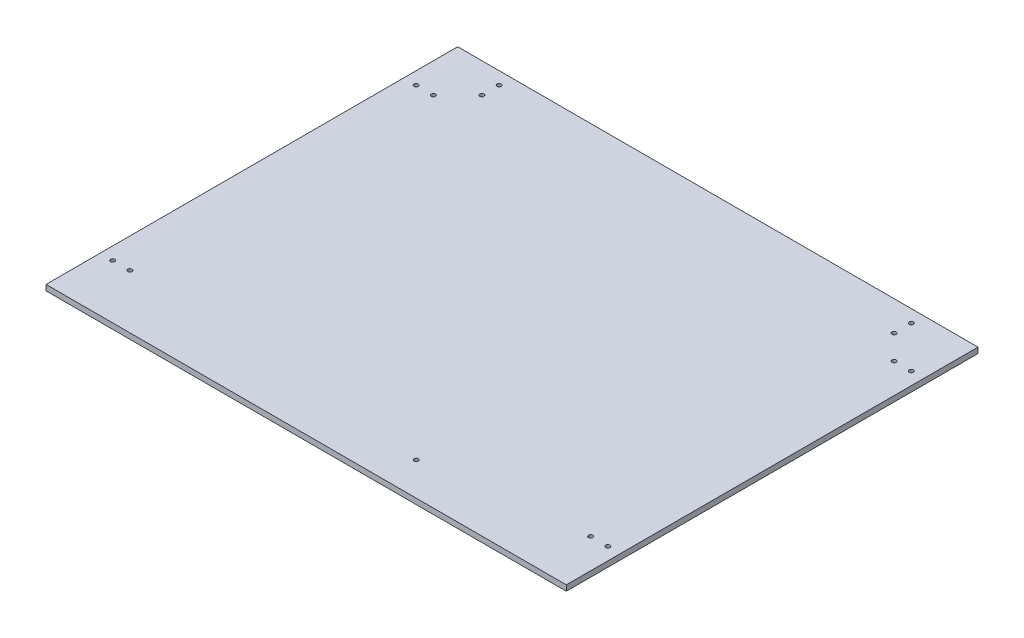
ISO-10303-21;
HEADER;
FILE_DESCRIPTION(('STEP AP214'),'2;1');
FILE_NAME('part.step','',(''),(''),'','','');
FILE_SCHEMA(('AUTOMOTIVE_DESIGN { 1 0 10303 214 1 1 1 1 }'));
ENDSEC;
DATA;
#1=APPLICATION_CONTEXT('core data for automotive mechanical design processes');
#2=APPLICATION_PROTOCOL_DEFINITION('international standard','automotive_design',2000,#1);
#3=PRODUCT_CONTEXT('',#1,'mechanical');
#4=PRODUCT('Part','Part','',(#3));
#5=PRODUCT_RELATED_PRODUCT_CATEGORY('part','',(#4));
#6=PRODUCT_DEFINITION_FORMATION('','',#4);
#7=PRODUCT_DEFINITION_CONTEXT('part definition',#1,'design');
#8=PRODUCT_DEFINITION('design','',#6,#7);
#9=PRODUCT_DEFINITION_SHAPE('','',#8);
#10=(LENGTH_UNIT() NAMED_UNIT(*) SI_UNIT(.MILLI.,.METRE.));
#11=(NAMED_UNIT(*) PLANE_ANGLE_UNIT() SI_UNIT($,.RADIAN.));
#12=(NAMED_UNIT(*) SI_UNIT($,.STERADIAN.) SOLID_ANGLE_UNIT());
#13=UNCERTAINTY_MEASURE_WITH_UNIT(LENGTH_MEASURE(1.E-05),#10,'distance_accuracy_value','');
#14=(GEOMETRIC_REPRESENTATION_CONTEXT(3) GLOBAL_UNCERTAINTY_ASSIGNED_CONTEXT((#13)) GLOBAL_UNIT_ASSIGNED_CONTEXT((#10,
#11,#12)) REPRESENTATION_CONTEXT('',''));
#15=CARTESIAN_POINT('',(0.,0.,0.));
#16=DIRECTION('',(0.,0.,1.));
#17=DIRECTION('',(1.,0.,0.));
#18=AXIS2_PLACEMENT_3D('',#15,#16,#17);
#19=CARTESIAN_POINT('',(-279.,6.,-220.75));
#20=DIRECTION('',(1.,0.,0.));
#21=DIRECTION('',(0.,0.,-1.));
#22=AXIS2_PLACEMENT_3D('',#19,#20,#21);
#23=PLANE('',#22);
#24=DIRECTION('',(0.,0.,1.));
#25=VECTOR('',#24,1.);
#26=CARTESIAN_POINT('',(-279.,0.,-220.75));
#27=LINE('',#26,#25);
#28=CARTESIAN_POINT('',(-279.,0.,-220.75));
#29=VERTEX_POINT('',#28);
#30=CARTESIAN_POINT('',(-279.,0.,220.75));
#31=VERTEX_POINT('',#30);
#32=EDGE_CURVE('E100',#29,#31,#27,.T.);
#33=ORIENTED_EDGE('',*,*,#32,.T.);
#34=DIRECTION('',(0.,-1.,0.));
#35=VECTOR('',#34,1.);
#36=CARTESIAN_POINT('',(-279.,6.,220.75));
#37=LINE('',#36,#35);
#38=CARTESIAN_POINT('',(-279.,6.,220.75));
#39=VERTEX_POINT('',#38);
#40=EDGE_CURVE('E11',#39,#31,#37,.T.);
#41=ORIENTED_EDGE('',*,*,#40,.F.);
#42=DIRECTION('',(0.,0.,1.));
#43=VECTOR('',#42,1.);
#44=CARTESIAN_POINT('',(-279.,6.,-220.75));
#45=LINE('',#44,#43);
#46=CARTESIAN_POINT('',(-279.,6.,-220.75));
#47=VERTEX_POINT('',#46);
#48=EDGE_CURVE('E88',#47,#39,#45,.T.);
#49=ORIENTED_EDGE('',*,*,#48,.F.);
#50=DIRECTION('',(0.,-1.,0.));
#51=VECTOR('',#50,1.);
#52=CARTESIAN_POINT('',(-279.,6.,-220.75));
#53=LINE('',#52,#51);
#54=EDGE_CURVE('E96',#47,#29,#53,.T.);
#55=ORIENTED_EDGE('',*,*,#54,.T.);
#56=EDGE_LOOP('',(#33,#41,#49,#55));
#57=FACE_BOUND('',#56,.T.);
#58=ADVANCED_FACE('F37',(#57),#23,.F.);
#59=CARTESIAN_POINT('',(-279.,6.,220.75));
#60=DIRECTION('',(0.,0.,-1.));
#61=DIRECTION('',(-1.,0.,0.));
#62=AXIS2_PLACEMENT_3D('',#59,#60,#61);
#63=PLANE('',#62);
#64=DIRECTION('',(1.,0.,0.));
#65=VECTOR('',#64,1.);
#66=CARTESIAN_POINT('',(-279.,0.,220.75));
#67=LINE('',#66,#65);
#68=CARTESIAN_POINT('',(279.,0.,220.75));
#69=VERTEX_POINT('',#68);
#70=EDGE_CURVE('E92',#31,#69,#67,.T.);
#71=ORIENTED_EDGE('',*,*,#70,.T.);
#72=DIRECTION('',(0.,-1.,0.));
#73=VECTOR('',#72,1.);
#74=CARTESIAN_POINT('',(279.,6.,220.75));
#75=LINE('',#74,#73);
#76=CARTESIAN_POINT('',(279.,6.,220.75));
#77=VERTEX_POINT('',#76);
#78=EDGE_CURVE('E45',#77,#69,#75,.T.);
#79=ORIENTED_EDGE('',*,*,#78,.F.);
#80=DIRECTION('',(1.,0.,0.));
#81=VECTOR('',#80,1.);
#82=CARTESIAN_POINT('',(-279.,6.,220.75));
#83=LINE('',#82,#81);
#84=EDGE_CURVE('E83',#39,#77,#83,.T.);
#85=ORIENTED_EDGE('',*,*,#84,.F.);
#86=ORIENTED_EDGE('',*,*,#40,.T.);
#87=EDGE_LOOP('',(#71,#79,#85,#86));
#88=FACE_BOUND('',#87,.T.);
#89=ADVANCED_FACE('F91',(#88),#63,.F.);
#90=CARTESIAN_POINT('',(279.,6.,-220.75));
#91=DIRECTION('',(-1.,0.,0.));
#92=DIRECTION('',(0.,0.,1.));
#93=AXIS2_PLACEMENT_3D('',#90,#91,#92);
#94=PLANE('',#93);
#95=DIRECTION('',(0.,0.,-1.));
#96=VECTOR('',#95,1.);
#97=CARTESIAN_POINT('',(279.,0.,-220.75));
#98=LINE('',#97,#96);
#99=CARTESIAN_POINT('',(279.,0.,-220.75));
#100=VERTEX_POINT('',#99);
#101=EDGE_CURVE('E70',#69,#100,#98,.T.);
#102=ORIENTED_EDGE('',*,*,#101,.T.);
#103=DIRECTION('',(0.,-1.,0.));
#104=VECTOR('',#103,1.);
#105=CARTESIAN_POINT('',(279.,6.,-220.75));
#106=LINE('',#105,#104);
#107=CARTESIAN_POINT('',(279.,6.,-220.75));
#108=VERTEX_POINT('',#107);
#109=EDGE_CURVE('E93',#108,#100,#106,.T.);
#110=ORIENTED_EDGE('',*,*,#109,.F.);
#111=DIRECTION('',(0.,0.,-1.));
#112=VECTOR('',#111,1.);
#113=CARTESIAN_POINT('',(279.,6.,-220.75));
#114=LINE('',#113,#112);
#115=EDGE_CURVE('E86',#77,#108,#114,.T.);
#116=ORIENTED_EDGE('',*,*,#115,.F.);
#117=ORIENTED_EDGE('',*,*,#78,.T.);
#118=EDGE_LOOP('',(#102,#110,#116,#117));
#119=FACE_BOUND('',#118,.T.);
#120=ADVANCED_FACE('F94',(#119),#94,.F.);
#121=CARTESIAN_POINT('',(-279.,6.,-220.75));
#122=DIRECTION('',(0.,0.,1.));
#123=DIRECTION('',(1.,0.,0.));
#124=AXIS2_PLACEMENT_3D('',#121,#122,#123);
#125=PLANE('',#124);
#126=DIRECTION('',(-1.,0.,0.));
#127=VECTOR('',#126,1.);
#128=CARTESIAN_POINT('',(-279.,0.,-220.75));
#129=LINE('',#128,#127);
#130=EDGE_CURVE('E76',#100,#29,#129,.T.);
#131=ORIENTED_EDGE('',*,*,#130,.T.);
#132=ORIENTED_EDGE('',*,*,#54,.F.);
#133=DIRECTION('',(-1.,0.,0.));
#134=VECTOR('',#133,1.);
#135=CARTESIAN_POINT('',(-279.,6.,-220.75));
#136=LINE('',#135,#134);
#137=EDGE_CURVE('E53',#108,#47,#136,.T.);
#138=ORIENTED_EDGE('',*,*,#137,.F.);
#139=ORIENTED_EDGE('',*,*,#109,.T.);
#140=EDGE_LOOP('',(#131,#132,#138,#139));
#141=FACE_BOUND('',#140,.T.);
#142=ADVANCED_FACE('F108',(#141),#125,.F.);
#143=CARTESIAN_POINT('',(0.,6.,0.));
#144=DIRECTION('',(0.,1.,0.));
#145=DIRECTION('',(0.,0.,1.));
#146=AXIS2_PLACEMENT_3D('',#143,#144,#145);
#147=PLANE('',#146);
#148=CARTESIAN_POINT('',(-265.5,6.,162.75));
#149=DIRECTION('',(0.,1.,0.));
#150=DIRECTION('',(0.,0.,1.));
#151=AXIS2_PLACEMENT_3D('',#148,#149,#150);
#152=CIRCLE('',#151,2.24999999999996);
#153=CARTESIAN_POINT('',(-265.5,6.,165.));
#154=VERTEX_POINT('',#153);
#155=EDGE_CURVE('E103',#154,#154,#152,.T.);
#156=ORIENTED_EDGE('',*,*,#155,.F.);
#157=EDGE_LOOP('',(#156));
#158=FACE_BOUND('',#157,.T.);
#159=CARTESIAN_POINT('',(-265.5,6.,-162.75));
#160=DIRECTION('',(0.,1.,0.));
#161=DIRECTION('',(0.,0.,1.));
#162=AXIS2_PLACEMENT_3D('',#159,#160,#161);
#163=CIRCLE('',#162,2.24999999999996);
#164=CARTESIAN_POINT('',(-265.5,6.,-160.5));
#165=VERTEX_POINT('',#164);
#166=EDGE_CURVE('E116',#165,#165,#163,.T.);
#167=ORIENTED_EDGE('',*,*,#166,.F.);
#168=EDGE_LOOP('',(#167));
#169=FACE_BOUND('',#168,.T.);
#170=CARTESIAN_POINT('',(-247.,6.,-162.75));
#171=DIRECTION('',(0.,1.,0.));
#172=DIRECTION('',(0.,0.,1.));
#173=AXIS2_PLACEMENT_3D('',#170,#171,#172);
#174=CIRCLE('',#173,2.25000000000001);
#175=CARTESIAN_POINT('',(-247.,6.,-160.5));
#176=VERTEX_POINT('',#175);
#177=EDGE_CURVE('E119',#176,#176,#174,.T.);
#178=ORIENTED_EDGE('',*,*,#177,.F.);
#179=EDGE_LOOP('',(#178));
#180=FACE_BOUND('',#179,.T.);
#181=CARTESIAN_POINT('',(-221.,6.,-188.75));
#182=DIRECTION('',(0.,1.,0.));
#183=DIRECTION('',(0.,0.,1.));
#184=AXIS2_PLACEMENT_3D('',#181,#182,#183);
#185=CIRCLE('',#184,2.25000000000001);
#186=CARTESIAN_POINT('',(-221.,6.,-186.5));
#187=VERTEX_POINT('',#186);
#188=EDGE_CURVE('E122',#187,#187,#185,.T.);
#189=ORIENTED_EDGE('',*,*,#188,.F.);
#190=EDGE_LOOP('',(#189));
#191=FACE_BOUND('',#190,.T.);
#192=CARTESIAN_POINT('',(221.,6.,-188.75));
#193=DIRECTION('',(0.,1.,0.));
#194=DIRECTION('',(0.,0.,1.));
#195=AXIS2_PLACEMENT_3D('',#192,#193,#194);
#196=CIRCLE('',#195,2.25000000000001);
#197=CARTESIAN_POINT('',(221.,6.,-186.5));
#198=VERTEX_POINT('',#197);
#199=EDGE_CURVE('E125',#198,#198,#196,.T.);
#200=ORIENTED_EDGE('',*,*,#199,.F.);
#201=EDGE_LOOP('',(#200));
#202=FACE_BOUND('',#201,.T.);
#203=CARTESIAN_POINT('',(247.,6.,-162.75));
#204=DIRECTION('',(0.,1.,0.));
#205=DIRECTION('',(0.,0.,1.));
#206=AXIS2_PLACEMENT_3D('',#203,#204,#205);
#207=CIRCLE('',#206,2.25000000000001);
#208=CARTESIAN_POINT('',(247.,6.,-160.5));
#209=VERTEX_POINT('',#208);
#210=EDGE_CURVE('E128',#209,#209,#207,.T.);
#211=ORIENTED_EDGE('',*,*,#210,.F.);
#212=EDGE_LOOP('',(#211));
#213=FACE_BOUND('',#212,.T.);
#214=CARTESIAN_POINT('',(265.5,6.,-162.75));
#215=DIRECTION('',(0.,1.,0.));
#216=DIRECTION('',(0.,0.,1.));
#217=AXIS2_PLACEMENT_3D('',#214,#215,#216);
#218=CIRCLE('',#217,2.24999999999996);
#219=CARTESIAN_POINT('',(265.5,6.,-160.5));
#220=VERTEX_POINT('',#219);
#221=EDGE_CURVE('E131',#220,#220,#218,.T.);
#222=ORIENTED_EDGE('',*,*,#221,.F.);
#223=EDGE_LOOP('',(#222));
#224=FACE_BOUND('',#223,.T.);
#225=CARTESIAN_POINT('',(-221.,6.,-207.25));
#226=DIRECTION('',(0.,1.,0.));
#227=DIRECTION('',(0.,0.,1.));
#228=AXIS2_PLACEMENT_3D('',#225,#226,#227);
#229=CIRCLE('',#228,2.25000000000001);
#230=CARTESIAN_POINT('',(-221.,6.,-205.));
#231=VERTEX_POINT('',#230);
#232=EDGE_CURVE('E134',#231,#231,#229,.T.);
#233=ORIENTED_EDGE('',*,*,#232,.F.);
#234=EDGE_LOOP('',(#233));
#235=FACE_BOUND('',#234,.T.);
#236=CARTESIAN_POINT('',(82.5000000000001,6.,185.25));
#237=DIRECTION('',(0.,1.,0.));
#238=DIRECTION('',(0.,0.,1.));
#239=AXIS2_PLACEMENT_3D('',#236,#237,#238);
#240=CIRCLE('',#239,2.24999999999997);
#241=CARTESIAN_POINT('',(82.5000000000001,6.,187.5));
#242=VERTEX_POINT('',#241);
#243=EDGE_CURVE('E137',#242,#242,#240,.T.);
#244=ORIENTED_EDGE('',*,*,#243,.F.);
#245=EDGE_LOOP('',(#244));
#246=FACE_BOUND('',#245,.T.);
#247=CARTESIAN_POINT('',(247.,6.,162.75));
#248=DIRECTION('',(0.,1.,0.));
#249=DIRECTION('',(0.,0.,1.));
#250=AXIS2_PLACEMENT_3D('',#247,#248,#249);
#251=CIRCLE('',#250,2.25000000000001);
#252=CARTESIAN_POINT('',(247.,6.,165.));
#253=VERTEX_POINT('',#252);
#254=EDGE_CURVE('E140',#253,#253,#251,.T.);
#255=ORIENTED_EDGE('',*,*,#254,.F.);
#256=EDGE_LOOP('',(#255));
#257=FACE_BOUND('',#256,.T.);
#258=CARTESIAN_POINT('',(265.5,6.,162.75));
#259=DIRECTION('',(0.,1.,0.));
#260=DIRECTION('',(0.,0.,1.));
#261=AXIS2_PLACEMENT_3D('',#258,#259,#260);
#262=CIRCLE('',#261,2.24999999999996);
#263=CARTESIAN_POINT('',(265.5,6.,165.));
#264=VERTEX_POINT('',#263);
#265=EDGE_CURVE('E143',#264,#264,#262,.T.);
#266=ORIENTED_EDGE('',*,*,#265,.F.);
#267=EDGE_LOOP('',(#266));
#268=FACE_BOUND('',#267,.T.);
#269=CARTESIAN_POINT('',(-247.,6.,162.75));
#270=DIRECTION('',(0.,1.,0.));
#271=DIRECTION('',(0.,0.,1.));
#272=AXIS2_PLACEMENT_3D('',#269,#270,#271);
#273=CIRCLE('',#272,2.25000000000001);
#274=CARTESIAN_POINT('',(-247.,6.,165.));
#275=VERTEX_POINT('',#274);
#276=EDGE_CURVE('E146',#275,#275,#273,.T.);
#277=ORIENTED_EDGE('',*,*,#276,.F.);
#278=EDGE_LOOP('',(#277));
#279=FACE_BOUND('',#278,.T.);
#280=CARTESIAN_POINT('',(221.,6.,-207.25));
#281=DIRECTION('',(0.,1.,0.));
#282=DIRECTION('',(0.,0.,1.));
#283=AXIS2_PLACEMENT_3D('',#280,#281,#282);
#284=CIRCLE('',#283,2.25000000000001);
#285=CARTESIAN_POINT('',(221.,6.,-205.));
#286=VERTEX_POINT('',#285);
#287=EDGE_CURVE('E149',#286,#286,#284,.T.);
#288=ORIENTED_EDGE('',*,*,#287,.F.);
#289=EDGE_LOOP('',(#288));
#290=FACE_BOUND('',#289,.T.);
#291=ORIENTED_EDGE('',*,*,#48,.T.);
#292=ORIENTED_EDGE('',*,*,#84,.T.);
#293=ORIENTED_EDGE('',*,*,#115,.T.);
#294=ORIENTED_EDGE('',*,*,#137,.T.);
#295=EDGE_LOOP('',(#291,#292,#293,#294));
#296=FACE_BOUND('',#295,.T.);
#297=ADVANCED_FACE('F84',(#158,#169,#180,#191,#202,#213,#224,#235,#246,#257,#268,#279,#290,
#296),#147,.T.);
#298=CARTESIAN_POINT('',(0.,0.,0.));
#299=DIRECTION('',(0.,1.,0.));
#300=DIRECTION('',(0.,0.,1.));
#301=AXIS2_PLACEMENT_3D('',#298,#299,#300);
#302=PLANE('',#301);
#303=CARTESIAN_POINT('',(-265.5,0.,162.75));
#304=DIRECTION('',(0.,-1.,0.));
#305=DIRECTION('',(0.,0.,-1.));
#306=AXIS2_PLACEMENT_3D('',#303,#304,#305);
#307=CIRCLE('',#306,2.24999999999996);
#308=CARTESIAN_POINT('',(-265.5,0.,160.5));
#309=VERTEX_POINT('',#308);
#310=EDGE_CURVE('E168',#309,#309,#307,.T.);
#311=ORIENTED_EDGE('',*,*,#310,.F.);
#312=EDGE_LOOP('',(#311));
#313=FACE_BOUND('',#312,.T.);
#314=CARTESIAN_POINT('',(-265.5,0.,-162.75));
#315=DIRECTION('',(0.,-1.,0.));
#316=DIRECTION('',(0.,0.,-1.));
#317=AXIS2_PLACEMENT_3D('',#314,#315,#316);
#318=CIRCLE('',#317,2.24999999999996);
#319=CARTESIAN_POINT('',(-265.5,0.,-165.));
#320=VERTEX_POINT('',#319);
#321=EDGE_CURVE('E171',#320,#320,#318,.T.);
#322=ORIENTED_EDGE('',*,*,#321,.F.);
#323=EDGE_LOOP('',(#322));
#324=FACE_BOUND('',#323,.T.);
#325=CARTESIAN_POINT('',(-247.,0.,-162.75));
#326=DIRECTION('',(0.,-1.,0.));
#327=DIRECTION('',(0.,0.,-1.));
#328=AXIS2_PLACEMENT_3D('',#325,#326,#327);
#329=CIRCLE('',#328,2.25000000000001);
#330=CARTESIAN_POINT('',(-247.,0.,-165.));
#331=VERTEX_POINT('',#330);
#332=EDGE_CURVE('E175',#331,#331,#329,.T.);
#333=ORIENTED_EDGE('',*,*,#332,.F.);
#334=EDGE_LOOP('',(#333));
#335=FACE_BOUND('',#334,.T.);
#336=CARTESIAN_POINT('',(-221.,0.,-188.75));
#337=DIRECTION('',(0.,-1.,0.));
#338=DIRECTION('',(0.,0.,-1.));
#339=AXIS2_PLACEMENT_3D('',#336,#337,#338);
#340=CIRCLE('',#339,2.25000000000001);
#341=CARTESIAN_POINT('',(-221.,0.,-191.));
#342=VERTEX_POINT('',#341);
#343=EDGE_CURVE('E165',#342,#342,#340,.T.);
#344=ORIENTED_EDGE('',*,*,#343,.F.);
#345=EDGE_LOOP('',(#344));
#346=FACE_BOUND('',#345,.T.);
#347=CARTESIAN_POINT('',(221.,0.,-188.75));
#348=DIRECTION('',(0.,-1.,0.));
#349=DIRECTION('',(0.,0.,-1.));
#350=AXIS2_PLACEMENT_3D('',#347,#348,#349);
#351=CIRCLE('',#350,2.25000000000001);
#352=CARTESIAN_POINT('',(221.,0.,-191.));
#353=VERTEX_POINT('',#352);
#354=EDGE_CURVE('E155',#353,#353,#351,.T.);
#355=ORIENTED_EDGE('',*,*,#354,.F.);
#356=EDGE_LOOP('',(#355));
#357=FACE_BOUND('',#356,.T.);
#358=CARTESIAN_POINT('',(247.,0.,-162.75));
#359=DIRECTION('',(0.,-1.,0.));
#360=DIRECTION('',(0.,0.,-1.));
#361=AXIS2_PLACEMENT_3D('',#358,#359,#360);
#362=CIRCLE('',#361,2.25000000000001);
#363=CARTESIAN_POINT('',(247.,0.,-165.));
#364=VERTEX_POINT('',#363);
#365=EDGE_CURVE('E156',#364,#364,#362,.T.);
#366=ORIENTED_EDGE('',*,*,#365,.F.);
#367=EDGE_LOOP('',(#366));
#368=FACE_BOUND('',#367,.T.);
#369=CARTESIAN_POINT('',(265.5,0.,-162.75));
#370=DIRECTION('',(0.,-1.,0.));
#371=DIRECTION('',(0.,0.,-1.));
#372=AXIS2_PLACEMENT_3D('',#369,#370,#371);
#373=CIRCLE('',#372,2.24999999999996);
#374=CARTESIAN_POINT('',(265.5,0.,-165.));
#375=VERTEX_POINT('',#374);
#376=EDGE_CURVE('E159',#375,#375,#373,.T.);
#377=ORIENTED_EDGE('',*,*,#376,.F.);
#378=EDGE_LOOP('',(#377));
#379=FACE_BOUND('',#378,.T.);
#380=CARTESIAN_POINT('',(-221.,0.,-207.25));
#381=DIRECTION('',(0.,-1.,0.));
#382=DIRECTION('',(0.,0.,-1.));
#383=AXIS2_PLACEMENT_3D('',#380,#381,#382);
#384=CIRCLE('',#383,2.25000000000001);
#385=CARTESIAN_POINT('',(-221.,0.,-209.5));
#386=VERTEX_POINT('',#385);
#387=EDGE_CURVE('E162',#386,#386,#384,.T.);
#388=ORIENTED_EDGE('',*,*,#387,.F.);
#389=EDGE_LOOP('',(#388));
#390=FACE_BOUND('',#389,.T.);
#391=CARTESIAN_POINT('',(82.5000000000001,0.,185.25));
#392=DIRECTION('',(0.,-1.,0.));
#393=DIRECTION('',(0.,0.,-1.));
#394=AXIS2_PLACEMENT_3D('',#391,#392,#393);
#395=CIRCLE('',#394,2.24999999999997);
#396=CARTESIAN_POINT('',(82.5000000000001,0.,183.));
#397=VERTEX_POINT('',#396);
#398=EDGE_CURVE('E186',#397,#397,#395,.T.);
#399=ORIENTED_EDGE('',*,*,#398,.F.);
#400=EDGE_LOOP('',(#399));
#401=FACE_BOUND('',#400,.T.);
#402=CARTESIAN_POINT('',(247.,0.,162.75));
#403=DIRECTION('',(0.,-1.,0.));
#404=DIRECTION('',(0.,0.,-1.));
#405=AXIS2_PLACEMENT_3D('',#402,#403,#404);
#406=CIRCLE('',#405,2.25000000000001);
#407=CARTESIAN_POINT('',(247.,0.,160.5));
#408=VERTEX_POINT('',#407);
#409=EDGE_CURVE('E183',#408,#408,#406,.T.);
#410=ORIENTED_EDGE('',*,*,#409,.F.);
#411=EDGE_LOOP('',(#410));
#412=FACE_BOUND('',#411,.T.);
#413=CARTESIAN_POINT('',(265.5,0.,162.75));
#414=DIRECTION('',(0.,-1.,0.));
#415=DIRECTION('',(0.,0.,-1.));
#416=AXIS2_PLACEMENT_3D('',#413,#414,#415);
#417=CIRCLE('',#416,2.24999999999996);
#418=CARTESIAN_POINT('',(265.5,0.,160.5));
#419=VERTEX_POINT('',#418);
#420=EDGE_CURVE('E180',#419,#419,#417,.T.);
#421=ORIENTED_EDGE('',*,*,#420,.F.);
#422=EDGE_LOOP('',(#421));
#423=FACE_BOUND('',#422,.T.);
#424=CARTESIAN_POINT('',(-247.,0.,162.75));
#425=DIRECTION('',(0.,-1.,0.));
#426=DIRECTION('',(0.,0.,-1.));
#427=AXIS2_PLACEMENT_3D('',#424,#425,#426);
#428=CIRCLE('',#427,2.25000000000001);
#429=CARTESIAN_POINT('',(-247.,0.,160.5));
#430=VERTEX_POINT('',#429);
#431=EDGE_CURVE('E172',#430,#430,#428,.T.);
#432=ORIENTED_EDGE('',*,*,#431,.F.);
#433=EDGE_LOOP('',(#432));
#434=FACE_BOUND('',#433,.T.);
#435=CARTESIAN_POINT('',(221.,0.,-207.25));
#436=DIRECTION('',(0.,-1.,0.));
#437=DIRECTION('',(0.,0.,-1.));
#438=AXIS2_PLACEMENT_3D('',#435,#436,#437);
#439=CIRCLE('',#438,2.25000000000001);
#440=CARTESIAN_POINT('',(221.,0.,-209.5));
#441=VERTEX_POINT('',#440);
#442=EDGE_CURVE('E152',#441,#441,#439,.T.);
#443=ORIENTED_EDGE('',*,*,#442,.F.);
#444=EDGE_LOOP('',(#443));
#445=FACE_BOUND('',#444,.T.);
#446=ORIENTED_EDGE('',*,*,#32,.F.);
#447=ORIENTED_EDGE('',*,*,#130,.F.);
#448=ORIENTED_EDGE('',*,*,#101,.F.);
#449=ORIENTED_EDGE('',*,*,#70,.F.);
#450=EDGE_LOOP('',(#446,#447,#448,#449));
#451=FACE_BOUND('',#450,.T.);
#452=ADVANCED_FACE('F111',(#313,#324,#335,#346,#357,#368,#379,#390,#401,#412,#423,#434,#445,
#451),#302,.F.);
#453=CARTESIAN_POINT('',(221.,10.,-207.25));
#454=DIRECTION('',(0.,-1.,0.));
#455=DIRECTION('',(0.,0.,-1.));
#456=AXIS2_PLACEMENT_3D('',#453,#454,#455);
#457=CYLINDRICAL_SURFACE('',#456,2.25000000000001);
#458=ORIENTED_EDGE('',*,*,#287,.T.);
#459=EDGE_LOOP('',(#458));
#460=FACE_BOUND('',#459,.T.);
#461=ORIENTED_EDGE('',*,*,#442,.T.);
#462=EDGE_LOOP('',(#461));
#463=FACE_BOUND('',#462,.T.);
#464=ADVANCED_FACE('F196',(#460,#463),#457,.F.);
#465=CARTESIAN_POINT('',(-247.,10.,162.75));
#466=DIRECTION('',(0.,-1.,0.));
#467=DIRECTION('',(0.,0.,-1.));
#468=AXIS2_PLACEMENT_3D('',#465,#466,#467);
#469=CYLINDRICAL_SURFACE('',#468,2.25000000000001);
#470=ORIENTED_EDGE('',*,*,#276,.T.);
#471=EDGE_LOOP('',(#470));
#472=FACE_BOUND('',#471,.T.);
#473=ORIENTED_EDGE('',*,*,#431,.T.);
#474=EDGE_LOOP('',(#473));
#475=FACE_BOUND('',#474,.T.);
#476=ADVANCED_FACE('F206',(#472,#475),#469,.F.);
#477=CARTESIAN_POINT('',(265.5,10.,162.75));
#478=DIRECTION('',(0.,-1.,0.));
#479=DIRECTION('',(0.,0.,-1.));
#480=AXIS2_PLACEMENT_3D('',#477,#478,#479);
#481=CYLINDRICAL_SURFACE('',#480,2.24999999999996);
#482=ORIENTED_EDGE('',*,*,#265,.T.);
#483=EDGE_LOOP('',(#482));
#484=FACE_BOUND('',#483,.T.);
#485=ORIENTED_EDGE('',*,*,#420,.T.);
#486=EDGE_LOOP('',(#485));
#487=FACE_BOUND('',#486,.T.);
#488=ADVANCED_FACE('F212',(#484,#487),#481,.F.);
#489=CARTESIAN_POINT('',(247.,10.,162.75));
#490=DIRECTION('',(0.,-1.,0.));
#491=DIRECTION('',(0.,0.,-1.));
#492=AXIS2_PLACEMENT_3D('',#489,#490,#491);
#493=CYLINDRICAL_SURFACE('',#492,2.25000000000001);
#494=ORIENTED_EDGE('',*,*,#254,.T.);
#495=EDGE_LOOP('',(#494));
#496=FACE_BOUND('',#495,.T.);
#497=ORIENTED_EDGE('',*,*,#409,.T.);
#498=EDGE_LOOP('',(#497));
#499=FACE_BOUND('',#498,.T.);
#500=ADVANCED_FACE('F192',(#496,#499),#493,.F.);
#501=CARTESIAN_POINT('',(82.5000000000001,10.,185.25));
#502=DIRECTION('',(0.,-1.,0.));
#503=DIRECTION('',(0.,0.,-1.));
#504=AXIS2_PLACEMENT_3D('',#501,#502,#503);
#505=CYLINDRICAL_SURFACE('',#504,2.24999999999997);
#506=ORIENTED_EDGE('',*,*,#243,.T.);
#507=EDGE_LOOP('',(#506));
#508=FACE_BOUND('',#507,.T.);
#509=ORIENTED_EDGE('',*,*,#398,.T.);
#510=EDGE_LOOP('',(#509));
#511=FACE_BOUND('',#510,.T.);
#512=ADVANCED_FACE('F264',(#508,#511),#505,.F.);
#513=CARTESIAN_POINT('',(-221.,10.,-207.25));
#514=DIRECTION('',(0.,-1.,0.));
#515=DIRECTION('',(0.,0.,-1.));
#516=AXIS2_PLACEMENT_3D('',#513,#514,#515);
#517=CYLINDRICAL_SURFACE('',#516,2.25000000000001);
#518=ORIENTED_EDGE('',*,*,#232,.T.);
#519=EDGE_LOOP('',(#518));
#520=FACE_BOUND('',#519,.T.);
#521=ORIENTED_EDGE('',*,*,#387,.T.);
#522=EDGE_LOOP('',(#521));
#523=FACE_BOUND('',#522,.T.);
#524=ADVANCED_FACE('F290',(#520,#523),#517,.F.);
#525=CARTESIAN_POINT('',(265.5,10.,-162.75));
#526=DIRECTION('',(0.,-1.,0.));
#527=DIRECTION('',(0.,0.,-1.));
#528=AXIS2_PLACEMENT_3D('',#525,#526,#527);
#529=CYLINDRICAL_SURFACE('',#528,2.24999999999996);
#530=ORIENTED_EDGE('',*,*,#221,.T.);
#531=EDGE_LOOP('',(#530));
#532=FACE_BOUND('',#531,.T.);
#533=ORIENTED_EDGE('',*,*,#376,.T.);
#534=EDGE_LOOP('',(#533));
#535=FACE_BOUND('',#534,.T.);
#536=ADVANCED_FACE('F286',(#532,#535),#529,.F.);
#537=CARTESIAN_POINT('',(247.,10.,-162.75));
#538=DIRECTION('',(0.,-1.,0.));
#539=DIRECTION('',(0.,0.,-1.));
#540=AXIS2_PLACEMENT_3D('',#537,#538,#539);
#541=CYLINDRICAL_SURFACE('',#540,2.25000000000001);
#542=ORIENTED_EDGE('',*,*,#210,.T.);
#543=EDGE_LOOP('',(#542));
#544=FACE_BOUND('',#543,.T.);
#545=ORIENTED_EDGE('',*,*,#365,.T.);
#546=EDGE_LOOP('',(#545));
#547=FACE_BOUND('',#546,.T.);
#548=ADVANCED_FACE('F289',(#544,#547),#541,.F.);
#549=CARTESIAN_POINT('',(221.,10.,-188.75));
#550=DIRECTION('',(0.,-1.,0.));
#551=DIRECTION('',(0.,0.,-1.));
#552=AXIS2_PLACEMENT_3D('',#549,#550,#551);
#553=CYLINDRICAL_SURFACE('',#552,2.25000000000001);
#554=ORIENTED_EDGE('',*,*,#199,.T.);
#555=EDGE_LOOP('',(#554));
#556=FACE_BOUND('',#555,.T.);
#557=ORIENTED_EDGE('',*,*,#354,.T.);
#558=EDGE_LOOP('',(#557));
#559=FACE_BOUND('',#558,.T.);
#560=ADVANCED_FACE('F273',(#556,#559),#553,.F.);
#561=CARTESIAN_POINT('',(-221.,10.,-188.75));
#562=DIRECTION('',(0.,-1.,0.));
#563=DIRECTION('',(0.,0.,-1.));
#564=AXIS2_PLACEMENT_3D('',#561,#562,#563);
#565=CYLINDRICAL_SURFACE('',#564,2.25000000000001);
#566=ORIENTED_EDGE('',*,*,#188,.T.);
#567=EDGE_LOOP('',(#566));
#568=FACE_BOUND('',#567,.T.);
#569=ORIENTED_EDGE('',*,*,#343,.T.);
#570=EDGE_LOOP('',(#569));
#571=FACE_BOUND('',#570,.T.);
#572=ADVANCED_FACE('F269',(#568,#571),#565,.F.);
#573=CARTESIAN_POINT('',(-247.,10.,-162.75));
#574=DIRECTION('',(0.,-1.,0.));
#575=DIRECTION('',(0.,0.,-1.));
#576=AXIS2_PLACEMENT_3D('',#573,#574,#575);
#577=CYLINDRICAL_SURFACE('',#576,2.25000000000001);
#578=ORIENTED_EDGE('',*,*,#177,.T.);
#579=EDGE_LOOP('',(#578));
#580=FACE_BOUND('',#579,.T.);
#581=ORIENTED_EDGE('',*,*,#332,.T.);
#582=EDGE_LOOP('',(#581));
#583=FACE_BOUND('',#582,.T.);
#584=ADVANCED_FACE('F272',(#580,#583),#577,.F.);
#585=CARTESIAN_POINT('',(-265.5,10.,-162.75));
#586=DIRECTION('',(0.,-1.,0.));
#587=DIRECTION('',(0.,0.,-1.));
#588=AXIS2_PLACEMENT_3D('',#585,#586,#587);
#589=CYLINDRICAL_SURFACE('',#588,2.24999999999996);
#590=ORIENTED_EDGE('',*,*,#166,.T.);
#591=EDGE_LOOP('',(#590));
#592=FACE_BOUND('',#591,.T.);
#593=ORIENTED_EDGE('',*,*,#321,.T.);
#594=EDGE_LOOP('',(#593));
#595=FACE_BOUND('',#594,.T.);
#596=ADVANCED_FACE('F277',(#592,#595),#589,.F.);
#597=CARTESIAN_POINT('',(-265.5,10.,162.75));
#598=DIRECTION('',(0.,-1.,0.));
#599=DIRECTION('',(0.,0.,-1.));
#600=AXIS2_PLACEMENT_3D('',#597,#598,#599);
#601=CYLINDRICAL_SURFACE('',#600,2.24999999999996);
#602=ORIENTED_EDGE('',*,*,#155,.T.);
#603=EDGE_LOOP('',(#602));
#604=FACE_BOUND('',#603,.T.);
#605=ORIENTED_EDGE('',*,*,#310,.T.);
#606=EDGE_LOOP('',(#605));
#607=FACE_BOUND('',#606,.T.);
#608=ADVANCED_FACE('F281',(#604,#607),#601,.F.);
#609=CLOSED_SHELL('',(#58,#89,#120,#142,#297,#452,#464,#476,#488,#500,#512,#524,#536,#548,#560,
#572,#584,#596,#608));
#610=MANIFOLD_SOLID_BREP('B2',#609);
#611=ADVANCED_BREP_SHAPE_REPRESENTATION('',(#18,#610),#14);
#612=SHAPE_DEFINITION_REPRESENTATION(#9,#611);
ENDSEC;
END-ISO-10303-21;
